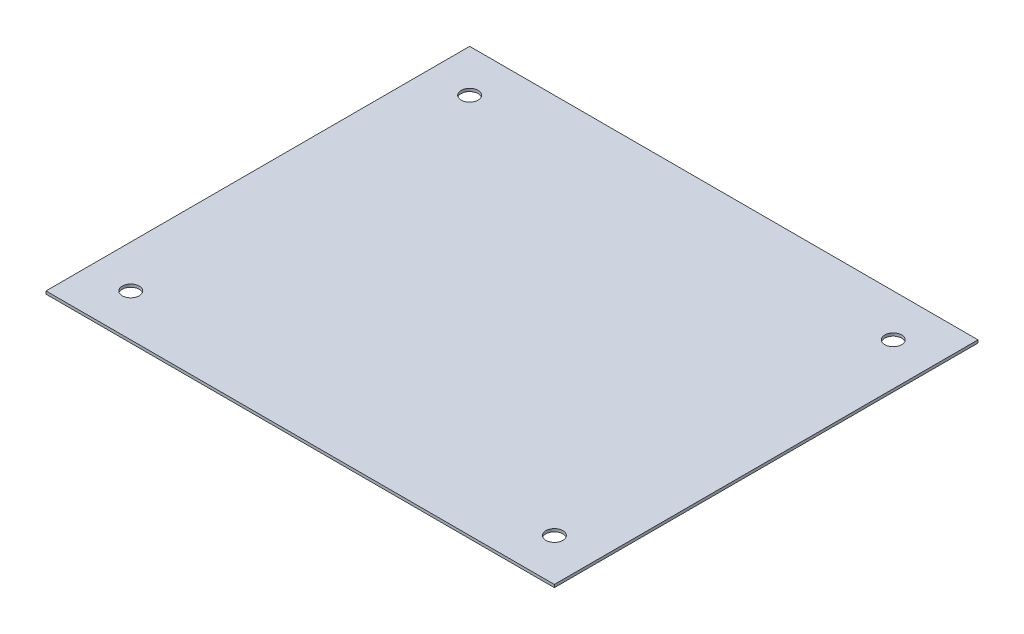
ISO-10303-21;
HEADER;
FILE_DESCRIPTION(('STEP AP214'),'2;1');
FILE_NAME('part.step','',(''),(''),'','','');
FILE_SCHEMA(('AUTOMOTIVE_DESIGN { 1 0 10303 214 1 1 1 1 }'));
ENDSEC;
DATA;
#1=APPLICATION_CONTEXT('core data for automotive mechanical design processes');
#2=APPLICATION_PROTOCOL_DEFINITION('international standard','automotive_design',2000,#1);
#3=PRODUCT_CONTEXT('',#1,'mechanical');
#4=PRODUCT('Part','Part','',(#3));
#5=PRODUCT_RELATED_PRODUCT_CATEGORY('part','',(#4));
#6=PRODUCT_DEFINITION_FORMATION('','',#4);
#7=PRODUCT_DEFINITION_CONTEXT('part definition',#1,'design');
#8=PRODUCT_DEFINITION('design','',#6,#7);
#9=PRODUCT_DEFINITION_SHAPE('','',#8);
#10=(LENGTH_UNIT() NAMED_UNIT(*) SI_UNIT(.MILLI.,.METRE.));
#11=(NAMED_UNIT(*) PLANE_ANGLE_UNIT() SI_UNIT($,.RADIAN.));
#12=(NAMED_UNIT(*) SI_UNIT($,.STERADIAN.) SOLID_ANGLE_UNIT());
#13=UNCERTAINTY_MEASURE_WITH_UNIT(LENGTH_MEASURE(1.E-05),#10,'distance_accuracy_value','');
#14=(GEOMETRIC_REPRESENTATION_CONTEXT(3) GLOBAL_UNCERTAINTY_ASSIGNED_CONTEXT((#13)) GLOBAL_UNIT_ASSIGNED_CONTEXT((#10,
#11,#12)) REPRESENTATION_CONTEXT('',''));
#15=CARTESIAN_POINT('',(0.,0.,0.));
#16=DIRECTION('',(0.,0.,1.));
#17=DIRECTION('',(1.,0.,0.));
#18=AXIS2_PLACEMENT_3D('',#15,#16,#17);
#19=CARTESIAN_POINT('',(90.,1.,-75.));
#20=DIRECTION('',(-1.,0.,0.));
#21=DIRECTION('',(0.,0.,1.));
#22=AXIS2_PLACEMENT_3D('',#19,#20,#21);
#23=PLANE('',#22);
#24=DIRECTION('',(0.,0.,-1.));
#25=VECTOR('',#24,1.);
#26=CARTESIAN_POINT('',(90.,0.,-75.));
#27=LINE('',#26,#25);
#28=CARTESIAN_POINT('',(90.,0.,75.));
#29=VERTEX_POINT('',#28);
#30=CARTESIAN_POINT('',(90.,0.,-75.));
#31=VERTEX_POINT('',#30);
#32=EDGE_CURVE('E105',#29,#31,#27,.T.);
#33=ORIENTED_EDGE('',*,*,#32,.T.);
#34=DIRECTION('',(0.,-1.,0.));
#35=VECTOR('',#34,1.);
#36=CARTESIAN_POINT('',(90.,1.,-75.));
#37=LINE('',#36,#35);
#38=CARTESIAN_POINT('',(90.,1.,-75.));
#39=VERTEX_POINT('',#38);
#40=EDGE_CURVE('E11',#39,#31,#37,.T.);
#41=ORIENTED_EDGE('',*,*,#40,.F.);
#42=DIRECTION('',(0.,0.,-1.));
#43=VECTOR('',#42,1.);
#44=CARTESIAN_POINT('',(90.,1.,-75.));
#45=LINE('',#44,#43);
#46=CARTESIAN_POINT('',(90.,1.,75.));
#47=VERTEX_POINT('',#46);
#48=EDGE_CURVE('E92',#47,#39,#45,.T.);
#49=ORIENTED_EDGE('',*,*,#48,.F.);
#50=DIRECTION('',(0.,-1.,0.));
#51=VECTOR('',#50,1.);
#52=CARTESIAN_POINT('',(90.,1.,75.));
#53=LINE('',#52,#51);
#54=EDGE_CURVE('E101',#47,#29,#53,.T.);
#55=ORIENTED_EDGE('',*,*,#54,.T.);
#56=EDGE_LOOP('',(#33,#41,#49,#55));
#57=FACE_BOUND('',#56,.T.);
#58=ADVANCED_FACE('F39',(#57),#23,.F.);
#59=CARTESIAN_POINT('',(-90.,1.,-75.));
#60=DIRECTION('',(0.,0.,1.));
#61=DIRECTION('',(1.,0.,0.));
#62=AXIS2_PLACEMENT_3D('',#59,#60,#61);
#63=PLANE('',#62);
#64=DIRECTION('',(-1.,0.,0.));
#65=VECTOR('',#64,1.);
#66=CARTESIAN_POINT('',(-90.,0.,-75.));
#67=LINE('',#66,#65);
#68=CARTESIAN_POINT('',(-90.,0.,-75.));
#69=VERTEX_POINT('',#68);
#70=EDGE_CURVE('E96',#31,#69,#67,.T.);
#71=ORIENTED_EDGE('',*,*,#70,.T.);
#72=DIRECTION('',(0.,-1.,0.));
#73=VECTOR('',#72,1.);
#74=CARTESIAN_POINT('',(-90.,1.,-75.));
#75=LINE('',#74,#73);
#76=CARTESIAN_POINT('',(-90.,1.,-75.));
#77=VERTEX_POINT('',#76);
#78=EDGE_CURVE('E48',#77,#69,#75,.T.);
#79=ORIENTED_EDGE('',*,*,#78,.F.);
#80=DIRECTION('',(-1.,0.,0.));
#81=VECTOR('',#80,1.);
#82=CARTESIAN_POINT('',(-90.,1.,-75.));
#83=LINE('',#82,#81);
#84=EDGE_CURVE('E87',#39,#77,#83,.T.);
#85=ORIENTED_EDGE('',*,*,#84,.F.);
#86=ORIENTED_EDGE('',*,*,#40,.T.);
#87=EDGE_LOOP('',(#71,#79,#85,#86));
#88=FACE_BOUND('',#87,.T.);
#89=ADVANCED_FACE('F95',(#88),#63,.F.);
#90=CARTESIAN_POINT('',(-90.,1.,-75.));
#91=DIRECTION('',(1.,0.,0.));
#92=DIRECTION('',(0.,0.,-1.));
#93=AXIS2_PLACEMENT_3D('',#90,#91,#92);
#94=PLANE('',#93);
#95=DIRECTION('',(0.,0.,1.));
#96=VECTOR('',#95,1.);
#97=CARTESIAN_POINT('',(-90.,0.,-75.));
#98=LINE('',#97,#96);
#99=CARTESIAN_POINT('',(-90.,0.,75.));
#100=VERTEX_POINT('',#99);
#101=EDGE_CURVE('E74',#69,#100,#98,.T.);
#102=ORIENTED_EDGE('',*,*,#101,.T.);
#103=DIRECTION('',(0.,-1.,0.));
#104=VECTOR('',#103,1.);
#105=CARTESIAN_POINT('',(-90.,1.,75.));
#106=LINE('',#105,#104);
#107=CARTESIAN_POINT('',(-90.,1.,75.));
#108=VERTEX_POINT('',#107);
#109=EDGE_CURVE('E97',#108,#100,#106,.T.);
#110=ORIENTED_EDGE('',*,*,#109,.F.);
#111=DIRECTION('',(0.,0.,1.));
#112=VECTOR('',#111,1.);
#113=CARTESIAN_POINT('',(-90.,1.,-75.));
#114=LINE('',#113,#112);
#115=EDGE_CURVE('E90',#77,#108,#114,.T.);
#116=ORIENTED_EDGE('',*,*,#115,.F.);
#117=ORIENTED_EDGE('',*,*,#78,.T.);
#118=EDGE_LOOP('',(#102,#110,#116,#117));
#119=FACE_BOUND('',#118,.T.);
#120=ADVANCED_FACE('F99',(#119),#94,.F.);
#121=CARTESIAN_POINT('',(-90.,1.,75.));
#122=DIRECTION('',(0.,0.,-1.));
#123=DIRECTION('',(-1.,0.,0.));
#124=AXIS2_PLACEMENT_3D('',#121,#122,#123);
#125=PLANE('',#124);
#126=DIRECTION('',(1.,0.,0.));
#127=VECTOR('',#126,1.);
#128=CARTESIAN_POINT('',(-90.,0.,75.));
#129=LINE('',#128,#127);
#130=EDGE_CURVE('E80',#100,#29,#129,.T.);
#131=ORIENTED_EDGE('',*,*,#130,.T.);
#132=ORIENTED_EDGE('',*,*,#54,.F.);
#133=DIRECTION('',(1.,0.,0.));
#134=VECTOR('',#133,1.);
#135=CARTESIAN_POINT('',(-90.,1.,75.));
#136=LINE('',#135,#134);
#137=EDGE_CURVE('E57',#108,#47,#136,.T.);
#138=ORIENTED_EDGE('',*,*,#137,.F.);
#139=ORIENTED_EDGE('',*,*,#109,.T.);
#140=EDGE_LOOP('',(#131,#132,#138,#139));
#141=FACE_BOUND('',#140,.T.);
#142=ADVANCED_FACE('F168',(#141),#125,.F.);
#143=CARTESIAN_POINT('',(0.,1.,0.));
#144=DIRECTION('',(0.,1.,0.));
#145=DIRECTION('',(0.,0.,1.));
#146=AXIS2_PLACEMENT_3D('',#143,#144,#145);
#147=PLANE('',#146);
#148=CARTESIAN_POINT('',(-75.,1.,60.0000000000001));
#149=DIRECTION('',(0.,1.,0.));
#150=DIRECTION('',(0.,0.,1.));
#151=AXIS2_PLACEMENT_3D('',#148,#149,#150);
#152=CIRCLE('',#151,3.00000000000001);
#153=CARTESIAN_POINT('',(-75.,1.,63.0000000000001));
#154=VERTEX_POINT('',#153);
#155=EDGE_CURVE('E108',#154,#154,#152,.T.);
#156=ORIENTED_EDGE('',*,*,#155,.F.);
#157=EDGE_LOOP('',(#156));
#158=FACE_BOUND('',#157,.T.);
#159=CARTESIAN_POINT('',(75.,1.,60.0000000000001));
#160=DIRECTION('',(0.,1.,0.));
#161=DIRECTION('',(0.,0.,1.));
#162=AXIS2_PLACEMENT_3D('',#159,#160,#161);
#163=CIRCLE('',#162,3.00000000000001);
#164=CARTESIAN_POINT('',(75.,1.,63.0000000000001));
#165=VERTEX_POINT('',#164);
#166=EDGE_CURVE('E123',#165,#165,#163,.T.);
#167=ORIENTED_EDGE('',*,*,#166,.F.);
#168=EDGE_LOOP('',(#167));
#169=FACE_BOUND('',#168,.T.);
#170=CARTESIAN_POINT('',(75.,1.,-60.));
#171=DIRECTION('',(0.,1.,0.));
#172=DIRECTION('',(0.,0.,1.));
#173=AXIS2_PLACEMENT_3D('',#170,#171,#172);
#174=CIRCLE('',#173,3.00000000000001);
#175=CARTESIAN_POINT('',(75.,1.,-57.));
#176=VERTEX_POINT('',#175);
#177=EDGE_CURVE('E120',#176,#176,#174,.T.);
#178=ORIENTED_EDGE('',*,*,#177,.F.);
#179=EDGE_LOOP('',(#178));
#180=FACE_BOUND('',#179,.T.);
#181=CARTESIAN_POINT('',(-75.,1.,-60.));
#182=DIRECTION('',(0.,1.,0.));
#183=DIRECTION('',(0.,0.,1.));
#184=AXIS2_PLACEMENT_3D('',#181,#182,#183);
#185=CIRCLE('',#184,3.00000000000001);
#186=CARTESIAN_POINT('',(-75.,1.,-57.));
#187=VERTEX_POINT('',#186);
#188=EDGE_CURVE('E117',#187,#187,#185,.T.);
#189=ORIENTED_EDGE('',*,*,#188,.F.);
#190=EDGE_LOOP('',(#189));
#191=FACE_BOUND('',#190,.T.);
#192=ORIENTED_EDGE('',*,*,#48,.T.);
#193=ORIENTED_EDGE('',*,*,#84,.T.);
#194=ORIENTED_EDGE('',*,*,#115,.T.);
#195=ORIENTED_EDGE('',*,*,#137,.T.);
#196=EDGE_LOOP('',(#192,#193,#194,#195));
#197=FACE_BOUND('',#196,.T.);
#198=ADVANCED_FACE('F88',(#158,#169,#180,#191,#197),#147,.T.);
#199=CARTESIAN_POINT('',(0.,0.,0.));
#200=DIRECTION('',(0.,1.,0.));
#201=DIRECTION('',(0.,0.,1.));
#202=AXIS2_PLACEMENT_3D('',#199,#200,#201);
#203=PLANE('',#202);
#204=CARTESIAN_POINT('',(-75.,0.,60.0000000000001));
#205=DIRECTION('',(0.,1.,0.));
#206=DIRECTION('',(0.,0.,1.));
#207=AXIS2_PLACEMENT_3D('',#204,#205,#206);
#208=CIRCLE('',#207,3.00000000000001);
#209=CARTESIAN_POINT('',(-75.,0.,63.0000000000001));
#210=VERTEX_POINT('',#209);
#211=EDGE_CURVE('E42',#210,#210,#208,.T.);
#212=ORIENTED_EDGE('',*,*,#211,.T.);
#213=EDGE_LOOP('',(#212));
#214=FACE_BOUND('',#213,.T.);
#215=CARTESIAN_POINT('',(75.,0.,60.0000000000001));
#216=DIRECTION('',(0.,1.,0.));
#217=DIRECTION('',(0.,0.,1.));
#218=AXIS2_PLACEMENT_3D('',#215,#216,#217);
#219=CIRCLE('',#218,3.00000000000001);
#220=CARTESIAN_POINT('',(75.,0.,63.0000000000001));
#221=VERTEX_POINT('',#220);
#222=EDGE_CURVE('E121',#221,#221,#219,.T.);
#223=ORIENTED_EDGE('',*,*,#222,.T.);
#224=EDGE_LOOP('',(#223));
#225=FACE_BOUND('',#224,.T.);
#226=CARTESIAN_POINT('',(75.,0.,-60.));
#227=DIRECTION('',(0.,1.,0.));
#228=DIRECTION('',(0.,0.,1.));
#229=AXIS2_PLACEMENT_3D('',#226,#227,#228);
#230=CIRCLE('',#229,3.00000000000001);
#231=CARTESIAN_POINT('',(75.,0.,-57.));
#232=VERTEX_POINT('',#231);
#233=EDGE_CURVE('E118',#232,#232,#230,.T.);
#234=ORIENTED_EDGE('',*,*,#233,.T.);
#235=EDGE_LOOP('',(#234));
#236=FACE_BOUND('',#235,.T.);
#237=CARTESIAN_POINT('',(-75.,0.,-60.));
#238=DIRECTION('',(0.,1.,0.));
#239=DIRECTION('',(0.,0.,1.));
#240=AXIS2_PLACEMENT_3D('',#237,#238,#239);
#241=CIRCLE('',#240,3.00000000000001);
#242=CARTESIAN_POINT('',(-75.,0.,-57.));
#243=VERTEX_POINT('',#242);
#244=EDGE_CURVE('E114',#243,#243,#241,.T.);
#245=ORIENTED_EDGE('',*,*,#244,.T.);
#246=EDGE_LOOP('',(#245));
#247=FACE_BOUND('',#246,.T.);
#248=ORIENTED_EDGE('',*,*,#32,.F.);
#249=ORIENTED_EDGE('',*,*,#130,.F.);
#250=ORIENTED_EDGE('',*,*,#101,.F.);
#251=ORIENTED_EDGE('',*,*,#70,.F.);
#252=EDGE_LOOP('',(#248,#249,#250,#251));
#253=FACE_BOUND('',#252,.T.);
#254=ADVANCED_FACE('F140',(#214,#225,#236,#247,#253),#203,.F.);
#255=CARTESIAN_POINT('',(-75.,-24.,-60.));
#256=DIRECTION('',(0.,1.,0.));
#257=DIRECTION('',(0.,0.,1.));
#258=AXIS2_PLACEMENT_3D('',#255,#256,#257);
#259=CYLINDRICAL_SURFACE('',#258,3.00000000000001);
#260=ORIENTED_EDGE('',*,*,#188,.T.);
#261=EDGE_LOOP('',(#260));
#262=FACE_BOUND('',#261,.T.);
#263=ORIENTED_EDGE('',*,*,#244,.F.);
#264=EDGE_LOOP('',(#263));
#265=FACE_BOUND('',#264,.T.);
#266=ADVANCED_FACE('F161',(#262,#265),#259,.F.);
#267=CARTESIAN_POINT('',(75.,-24.,-60.));
#268=DIRECTION('',(0.,1.,0.));
#269=DIRECTION('',(0.,0.,1.));
#270=AXIS2_PLACEMENT_3D('',#267,#268,#269);
#271=CYLINDRICAL_SURFACE('',#270,3.00000000000001);
#272=ORIENTED_EDGE('',*,*,#177,.T.);
#273=EDGE_LOOP('',(#272));
#274=FACE_BOUND('',#273,.T.);
#275=ORIENTED_EDGE('',*,*,#233,.F.);
#276=EDGE_LOOP('',(#275));
#277=FACE_BOUND('',#276,.T.);
#278=ADVANCED_FACE('F149',(#274,#277),#271,.F.);
#279=CARTESIAN_POINT('',(75.,-24.,60.0000000000001));
#280=DIRECTION('',(0.,1.,0.));
#281=DIRECTION('',(0.,0.,1.));
#282=AXIS2_PLACEMENT_3D('',#279,#280,#281);
#283=CYLINDRICAL_SURFACE('',#282,3.00000000000001);
#284=ORIENTED_EDGE('',*,*,#166,.T.);
#285=EDGE_LOOP('',(#284));
#286=FACE_BOUND('',#285,.T.);
#287=ORIENTED_EDGE('',*,*,#222,.F.);
#288=EDGE_LOOP('',(#287));
#289=FACE_BOUND('',#288,.T.);
#290=ADVANCED_FACE('F144',(#286,#289),#283,.F.);
#291=CARTESIAN_POINT('',(-75.,-24.,60.0000000000001));
#292=DIRECTION('',(0.,1.,0.));
#293=DIRECTION('',(0.,0.,1.));
#294=AXIS2_PLACEMENT_3D('',#291,#292,#293);
#295=CYLINDRICAL_SURFACE('',#294,3.00000000000001);
#296=ORIENTED_EDGE('',*,*,#155,.T.);
#297=EDGE_LOOP('',(#296));
#298=FACE_BOUND('',#297,.T.);
#299=ORIENTED_EDGE('',*,*,#211,.F.);
#300=EDGE_LOOP('',(#299));
#301=FACE_BOUND('',#300,.T.);
#302=ADVANCED_FACE('F142',(#298,#301),#295,.F.);
#303=CLOSED_SHELL('',(#58,#89,#120,#142,#198,#254,#266,#278,#290,#302));
#304=MANIFOLD_SOLID_BREP('B2',#303);
#305=ADVANCED_BREP_SHAPE_REPRESENTATION('',(#18,#304),#14);
#306=SHAPE_DEFINITION_REPRESENTATION(#9,#305);
ENDSEC;
END-ISO-10303-21;
